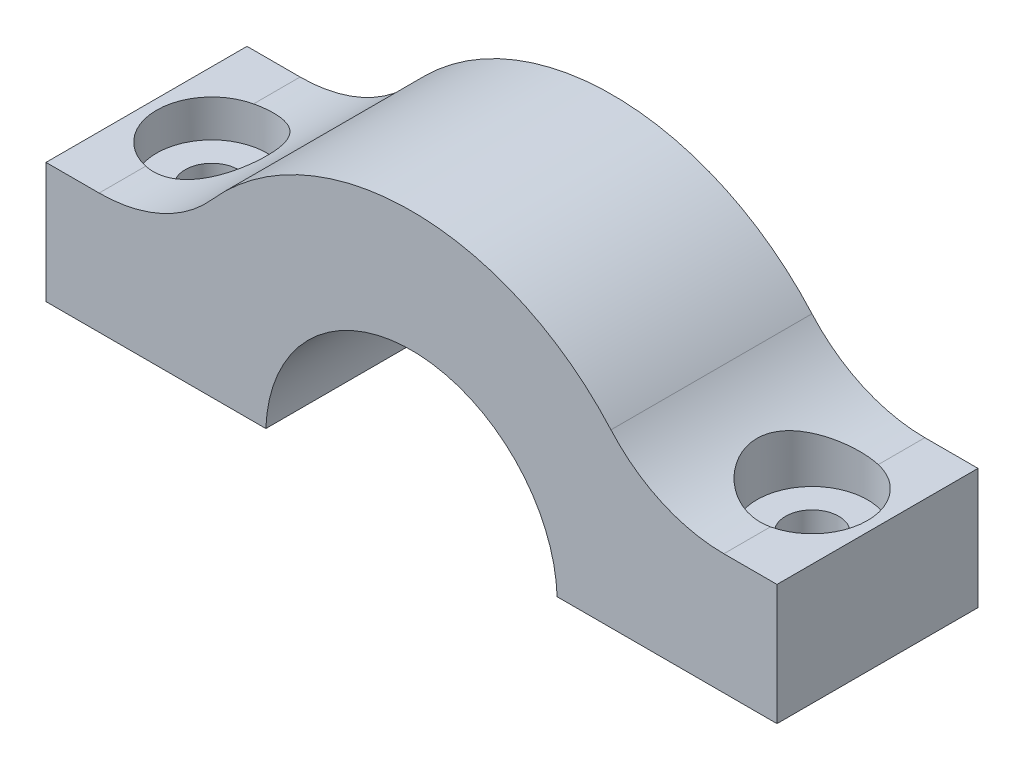
ISO-10303-21;
HEADER;
FILE_DESCRIPTION(('STEP AP214'),'2;1');
FILE_NAME('part.step','',(''),(''),'','','');
FILE_SCHEMA(('AUTOMOTIVE_DESIGN { 1 0 10303 214 1 1 1 1 }'));
ENDSEC;
DATA;
#1=APPLICATION_CONTEXT('core data for automotive mechanical design processes');
#2=APPLICATION_PROTOCOL_DEFINITION('international standard','automotive_design',2000,#1);
#3=PRODUCT_CONTEXT('',#1,'mechanical');
#4=PRODUCT('Part','Part','',(#3));
#5=PRODUCT_RELATED_PRODUCT_CATEGORY('part','',(#4));
#6=PRODUCT_DEFINITION_FORMATION('','',#4);
#7=PRODUCT_DEFINITION_CONTEXT('part definition',#1,'design');
#8=PRODUCT_DEFINITION('design','',#6,#7);
#9=PRODUCT_DEFINITION_SHAPE('','',#8);
#10=(LENGTH_UNIT() NAMED_UNIT(*) SI_UNIT(.MILLI.,.METRE.));
#11=(NAMED_UNIT(*) PLANE_ANGLE_UNIT() SI_UNIT($,.RADIAN.));
#12=(NAMED_UNIT(*) SI_UNIT($,.STERADIAN.) SOLID_ANGLE_UNIT());
#13=UNCERTAINTY_MEASURE_WITH_UNIT(LENGTH_MEASURE(1.E-05),#10,'distance_accuracy_value','');
#14=(GEOMETRIC_REPRESENTATION_CONTEXT(3) GLOBAL_UNCERTAINTY_ASSIGNED_CONTEXT((#13)) GLOBAL_UNIT_ASSIGNED_CONTEXT((#10,
#11,#12)) REPRESENTATION_CONTEXT('',''));
#15=CARTESIAN_POINT('',(0.,0.,0.));
#16=DIRECTION('',(0.,0.,1.));
#17=DIRECTION('',(1.,0.,0.));
#18=AXIS2_PLACEMENT_3D('',#15,#16,#17);
#19=CARTESIAN_POINT('',(0.,23.,10.));
#20=DIRECTION('',(0.,0.,-1.));
#21=DIRECTION('',(-1.,0.,0.));
#22=AXIS2_PLACEMENT_3D('',#19,#20,#21);
#23=CYLINDRICAL_SURFACE('',#22,26.5);
#24=CARTESIAN_POINT('',(0.,23.,-10.));
#25=DIRECTION('',(0.,0.,1.));
#26=DIRECTION('',(1.,0.,0.));
#27=AXIS2_PLACEMENT_3D('',#24,#25,#26);
#28=CIRCLE('',#27,26.5);
#29=CARTESIAN_POINT('',(-19.846610221681,40.5602409638554,-10.));
#30=VERTEX_POINT('',#29);
#31=CARTESIAN_POINT('',(19.846610221681,40.5602409638554,-10.));
#32=VERTEX_POINT('',#31);
#33=EDGE_CURVE('E266',#30,#32,#28,.F.);
#34=ORIENTED_EDGE('',*,*,#33,.F.);
#35=DIRECTION('',(0.,0.,-1.));
#36=VECTOR('',#35,1.);
#37=CARTESIAN_POINT('',(-19.846610221681,40.5602409638554,10.));
#38=LINE('',#37,#36);
#39=CARTESIAN_POINT('',(-19.846610221681,40.5602409638554,10.));
#40=VERTEX_POINT('',#39);
#41=EDGE_CURVE('E286',#30,#40,#38,.F.);
#42=ORIENTED_EDGE('',*,*,#41,.T.);
#43=CARTESIAN_POINT('',(0.,23.,10.));
#44=DIRECTION('',(0.,0.,1.));
#45=DIRECTION('',(1.,0.,0.));
#46=AXIS2_PLACEMENT_3D('',#43,#44,#45);
#47=CIRCLE('',#46,26.5);
#48=CARTESIAN_POINT('',(19.846610221681,40.5602409638554,10.));
#49=VERTEX_POINT('',#48);
#50=EDGE_CURVE('E248',#40,#49,#47,.F.);
#51=ORIENTED_EDGE('',*,*,#50,.T.);
#52=DIRECTION('',(0.,0.,-1.));
#53=VECTOR('',#52,1.);
#54=CARTESIAN_POINT('',(19.846610221681,40.5602409638554,10.));
#55=LINE('',#54,#53);
#56=EDGE_CURVE('E283',#49,#32,#55,.T.);
#57=ORIENTED_EDGE('',*,*,#56,.T.);
#58=EDGE_LOOP('',(#34,#42,#51,#57));
#59=FACE_BOUND('',#58,.T.);
#60=ADVANCED_FACE('F34',(#59),#23,.T.);
#61=CARTESIAN_POINT('',(0.,35.5,10.));
#62=DIRECTION('',(0.,1.,0.));
#63=DIRECTION('',(-1.,0.,0.));
#64=AXIS2_PLACEMENT_3D('',#61,#62,#63);
#65=PLANE('',#64);
#66=DIRECTION('',(1.,0.,0.));
#67=VECTOR('',#66,1.);
#68=CARTESIAN_POINT('',(0.,35.5,10.));
#69=LINE('',#68,#67);
#70=CARTESIAN_POINT('',(-36.3666428910959,35.5,10.));
#71=VERTEX_POINT('',#70);
#72=CARTESIAN_POINT('',(-31.0805405358401,35.5,10.));
#73=VERTEX_POINT('',#72);
#74=EDGE_CURVE('E330',#71,#73,#69,.T.);
#75=ORIENTED_EDGE('',*,*,#74,.T.);
#76=DIRECTION('',(0.,0.,1.));
#77=VECTOR('',#76,1.);
#78=CARTESIAN_POINT('',(-31.0805405358401,35.5,-10.));
#79=LINE('',#78,#77);
#80=CARTESIAN_POINT('',(-31.0805405358401,35.4999999999999,5.36436878934366));
#81=VERTEX_POINT('',#80);
#82=EDGE_CURVE('E280',#73,#81,#79,.F.);
#83=ORIENTED_EDGE('',*,*,#82,.T.);
#84=CARTESIAN_POINT('',(-29.8666428910959,35.4999999999999,0.));
#85=DIRECTION('',(0.,1.,0.));
#86=DIRECTION('',(0.,0.,1.));
#87=AXIS2_PLACEMENT_3D('',#84,#85,#86);
#88=CIRCLE('',#87,5.5);
#89=CARTESIAN_POINT('',(-31.0805405358401,35.4999999999999,-5.36436878934366));
#90=VERTEX_POINT('',#89);
#91=EDGE_CURVE('E271',#90,#81,#88,.T.);
#92=ORIENTED_EDGE('',*,*,#91,.F.);
#93=DIRECTION('',(0.,0.,1.));
#94=VECTOR('',#93,1.);
#95=CARTESIAN_POINT('',(-31.0805405358401,35.5,-10.));
#96=LINE('',#95,#94);
#97=CARTESIAN_POINT('',(-31.0805405358401,35.5,-10.));
#98=VERTEX_POINT('',#97);
#99=EDGE_CURVE('E262',#90,#98,#96,.F.);
#100=ORIENTED_EDGE('',*,*,#99,.T.);
#101=DIRECTION('',(1.,0.,0.));
#102=VECTOR('',#101,1.);
#103=CARTESIAN_POINT('',(0.,35.5,-10.));
#104=LINE('',#103,#102);
#105=CARTESIAN_POINT('',(-36.3666428910959,35.5,-10.));
#106=VERTEX_POINT('',#105);
#107=EDGE_CURVE('E230',#106,#98,#104,.T.);
#108=ORIENTED_EDGE('',*,*,#107,.F.);
#109=DIRECTION('',(0.,0.,-1.));
#110=VECTOR('',#109,1.);
#111=CARTESIAN_POINT('',(-36.3666428910959,35.5,10.));
#112=LINE('',#111,#110);
#113=EDGE_CURVE('E226',#71,#106,#112,.T.);
#114=ORIENTED_EDGE('',*,*,#113,.F.);
#115=EDGE_LOOP('',(#75,#83,#92,#100,#108,#114));
#116=FACE_BOUND('',#115,.T.);
#117=ADVANCED_FACE('F147',(#116),#65,.T.);
#118=CARTESIAN_POINT('',(-36.3666428910958,0.,10.));
#119=DIRECTION('',(-1.,0.,0.));
#120=DIRECTION('',(0.,-1.,0.));
#121=AXIS2_PLACEMENT_3D('',#118,#119,#120);
#122=PLANE('',#121);
#123=DIRECTION('',(0.,1.,0.));
#124=VECTOR('',#123,1.);
#125=CARTESIAN_POINT('',(-36.3666428910958,0.,-10.));
#126=LINE('',#125,#124);
#127=CARTESIAN_POINT('',(-36.3666428910959,23.5,-10.));
#128=VERTEX_POINT('',#127);
#129=EDGE_CURVE('E221',#128,#106,#126,.T.);
#130=ORIENTED_EDGE('',*,*,#129,.F.);
#131=DIRECTION('',(0.,0.,-1.));
#132=VECTOR('',#131,1.);
#133=CARTESIAN_POINT('',(-36.3666428910959,23.5,10.));
#134=LINE('',#133,#132);
#135=CARTESIAN_POINT('',(-36.3666428910959,23.5,10.));
#136=VERTEX_POINT('',#135);
#137=EDGE_CURVE('E224',#136,#128,#134,.T.);
#138=ORIENTED_EDGE('',*,*,#137,.F.);
#139=DIRECTION('',(0.,1.,0.));
#140=VECTOR('',#139,1.);
#141=CARTESIAN_POINT('',(-36.3666428910958,0.,10.));
#142=LINE('',#141,#140);
#143=EDGE_CURVE('E333',#136,#71,#142,.T.);
#144=ORIENTED_EDGE('',*,*,#143,.T.);
#145=ORIENTED_EDGE('',*,*,#113,.T.);
#146=EDGE_LOOP('',(#130,#138,#144,#145));
#147=FACE_BOUND('',#146,.T.);
#148=ADVANCED_FACE('F154',(#147),#122,.T.);
#149=CARTESIAN_POINT('',(0.,23.5,10.));
#150=DIRECTION('',(0.,-1.,0.));
#151=DIRECTION('',(1.,0.,0.));
#152=AXIS2_PLACEMENT_3D('',#149,#150,#151);
#153=PLANE('',#152);
#154=CARTESIAN_POINT('',(-19.,23.5,0.));
#155=DIRECTION('',(0.,-1.,0.));
#156=DIRECTION('',(1.,0.,0.));
#157=AXIS2_PLACEMENT_3D('',#154,#155,#156);
#158=CIRCLE('',#157,0.985720517649482);
#159=CARTESIAN_POINT('',(-18.0142794823505,23.5,0.));
#160=VERTEX_POINT('',#159);
#161=EDGE_CURVE('E277',#160,#160,#158,.T.);
#162=ORIENTED_EDGE('',*,*,#161,.F.);
#163=EDGE_LOOP('',(#162));
#164=FACE_BOUND('',#163,.T.);
#165=CARTESIAN_POINT('',(-29.8666428910959,23.5,0.));
#166=DIRECTION('',(0.,-1.,0.));
#167=DIRECTION('',(1.,0.,0.));
#168=AXIS2_PLACEMENT_3D('',#165,#166,#167);
#169=CIRCLE('',#168,2.65);
#170=CARTESIAN_POINT('',(-27.2166428910959,23.5,0.));
#171=VERTEX_POINT('',#170);
#172=EDGE_CURVE('E263',#171,#171,#169,.T.);
#173=ORIENTED_EDGE('',*,*,#172,.F.);
#174=EDGE_LOOP('',(#173));
#175=FACE_BOUND('',#174,.T.);
#176=DIRECTION('',(-1.,0.,0.));
#177=VECTOR('',#176,1.);
#178=CARTESIAN_POINT('',(0.,23.5,-10.));
#179=LINE('',#178,#177);
#180=CARTESIAN_POINT('',(-14.4913767461894,23.5,-10.));
#181=VERTEX_POINT('',#180);
#182=EDGE_CURVE('E229',#181,#128,#179,.T.);
#183=ORIENTED_EDGE('',*,*,#182,.F.);
#184=DIRECTION('',(0.,0.,-1.));
#185=VECTOR('',#184,1.);
#186=CARTESIAN_POINT('',(-14.4913767461894,23.5,10.));
#187=LINE('',#186,#185);
#188=CARTESIAN_POINT('',(-14.4913767461894,23.5,10.));
#189=VERTEX_POINT('',#188);
#190=EDGE_CURVE('E258',#189,#181,#187,.T.);
#191=ORIENTED_EDGE('',*,*,#190,.F.);
#192=DIRECTION('',(-1.,0.,0.));
#193=VECTOR('',#192,1.);
#194=CARTESIAN_POINT('',(0.,23.5,10.));
#195=LINE('',#194,#193);
#196=EDGE_CURVE('E335',#189,#136,#195,.T.);
#197=ORIENTED_EDGE('',*,*,#196,.T.);
#198=ORIENTED_EDGE('',*,*,#137,.T.);
#199=EDGE_LOOP('',(#183,#191,#197,#198));
#200=FACE_BOUND('',#199,.T.);
#201=ADVANCED_FACE('F210',(#164,#175,#200),#153,.T.);
#202=CARTESIAN_POINT('',(0.,23.,10.));
#203=DIRECTION('',(0.,0.,-1.));
#204=DIRECTION('',(-1.,0.,0.));
#205=AXIS2_PLACEMENT_3D('',#202,#203,#204);
#206=CYLINDRICAL_SURFACE('',#205,14.5);
#207=CARTESIAN_POINT('',(0.,23.,-10.));
#208=DIRECTION('',(0.,0.,1.));
#209=DIRECTION('',(1.,0.,0.));
#210=AXIS2_PLACEMENT_3D('',#207,#208,#209);
#211=CIRCLE('',#210,14.5);
#212=CARTESIAN_POINT('',(14.4913767461894,23.5,-10.));
#213=VERTEX_POINT('',#212);
#214=EDGE_CURVE('E236',#213,#181,#211,.T.);
#215=ORIENTED_EDGE('',*,*,#214,.F.);
#216=DIRECTION('',(0.,0.,-1.));
#217=VECTOR('',#216,1.);
#218=CARTESIAN_POINT('',(14.4913767461894,23.5,10.));
#219=LINE('',#218,#217);
#220=CARTESIAN_POINT('',(14.4913767461894,23.5,10.));
#221=VERTEX_POINT('',#220);
#222=EDGE_CURVE('E256',#221,#213,#219,.T.);
#223=ORIENTED_EDGE('',*,*,#222,.F.);
#224=CARTESIAN_POINT('',(0.,23.,10.));
#225=DIRECTION('',(0.,0.,1.));
#226=DIRECTION('',(1.,0.,0.));
#227=AXIS2_PLACEMENT_3D('',#224,#225,#226);
#228=CIRCLE('',#227,14.5);
#229=EDGE_CURVE('E338',#221,#189,#228,.T.);
#230=ORIENTED_EDGE('',*,*,#229,.T.);
#231=ORIENTED_EDGE('',*,*,#190,.T.);
#232=EDGE_LOOP('',(#215,#223,#230,#231));
#233=FACE_BOUND('',#232,.T.);
#234=ADVANCED_FACE('F206',(#233),#206,.F.);
#235=CARTESIAN_POINT('',(0.,23.5,10.));
#236=DIRECTION('',(0.,1.,0.));
#237=DIRECTION('',(-1.,0.,0.));
#238=AXIS2_PLACEMENT_3D('',#235,#236,#237);
#239=PLANE('',#238);
#240=CARTESIAN_POINT('',(19.,23.5,0.));
#241=DIRECTION('',(0.,1.,0.));
#242=DIRECTION('',(-1.,0.,0.));
#243=AXIS2_PLACEMENT_3D('',#240,#241,#242);
#244=CIRCLE('',#243,0.985720517649486);
#245=CARTESIAN_POINT('',(18.0142794823505,23.5,0.));
#246=VERTEX_POINT('',#245);
#247=EDGE_CURVE('E273',#246,#246,#244,.T.);
#248=ORIENTED_EDGE('',*,*,#247,.T.);
#249=EDGE_LOOP('',(#248));
#250=FACE_BOUND('',#249,.T.);
#251=CARTESIAN_POINT('',(29.8666428910958,23.5,0.));
#252=DIRECTION('',(0.,1.,0.));
#253=DIRECTION('',(-1.,0.,0.));
#254=AXIS2_PLACEMENT_3D('',#251,#252,#253);
#255=CIRCLE('',#254,2.65);
#256=CARTESIAN_POINT('',(27.2166428910958,23.5,0.));
#257=VERTEX_POINT('',#256);
#258=EDGE_CURVE('E268',#257,#257,#255,.T.);
#259=ORIENTED_EDGE('',*,*,#258,.T.);
#260=EDGE_LOOP('',(#259));
#261=FACE_BOUND('',#260,.T.);
#262=DIRECTION('',(1.,0.,0.));
#263=VECTOR('',#262,1.);
#264=CARTESIAN_POINT('',(0.,23.5,-10.));
#265=LINE('',#264,#263);
#266=CARTESIAN_POINT('',(36.3666428910958,23.5,-10.));
#267=VERTEX_POINT('',#266);
#268=EDGE_CURVE('E239',#213,#267,#265,.T.);
#269=ORIENTED_EDGE('',*,*,#268,.T.);
#270=DIRECTION('',(0.,0.,-1.));
#271=VECTOR('',#270,1.);
#272=CARTESIAN_POINT('',(36.3666428910958,23.5,10.));
#273=LINE('',#272,#271);
#274=CARTESIAN_POINT('',(36.3666428910958,23.5,10.));
#275=VERTEX_POINT('',#274);
#276=EDGE_CURVE('E252',#275,#267,#273,.T.);
#277=ORIENTED_EDGE('',*,*,#276,.F.);
#278=DIRECTION('',(1.,0.,0.));
#279=VECTOR('',#278,1.);
#280=CARTESIAN_POINT('',(0.,23.5,10.));
#281=LINE('',#280,#279);
#282=EDGE_CURVE('E341',#221,#275,#281,.T.);
#283=ORIENTED_EDGE('',*,*,#282,.F.);
#284=ORIENTED_EDGE('',*,*,#222,.T.);
#285=EDGE_LOOP('',(#269,#277,#283,#284));
#286=FACE_BOUND('',#285,.T.);
#287=ADVANCED_FACE('F202',(#250,#261,#286),#239,.F.);
#288=CARTESIAN_POINT('',(36.3666428910958,0.,10.));
#289=DIRECTION('',(-1.,0.,0.));
#290=DIRECTION('',(0.,-1.,0.));
#291=AXIS2_PLACEMENT_3D('',#288,#289,#290);
#292=PLANE('',#291);
#293=DIRECTION('',(0.,1.,0.));
#294=VECTOR('',#293,1.);
#295=CARTESIAN_POINT('',(36.3666428910958,0.,-10.));
#296=LINE('',#295,#294);
#297=CARTESIAN_POINT('',(36.3666428910959,35.5,-10.));
#298=VERTEX_POINT('',#297);
#299=EDGE_CURVE('E244',#267,#298,#296,.T.);
#300=ORIENTED_EDGE('',*,*,#299,.T.);
#301=DIRECTION('',(0.,0.,-1.));
#302=VECTOR('',#301,1.);
#303=CARTESIAN_POINT('',(36.3666428910959,35.5,10.));
#304=LINE('',#303,#302);
#305=CARTESIAN_POINT('',(36.3666428910959,35.5,10.));
#306=VERTEX_POINT('',#305);
#307=EDGE_CURVE('E249',#306,#298,#304,.T.);
#308=ORIENTED_EDGE('',*,*,#307,.F.);
#309=DIRECTION('',(0.,1.,0.));
#310=VECTOR('',#309,1.);
#311=CARTESIAN_POINT('',(36.3666428910958,0.,10.));
#312=LINE('',#311,#310);
#313=EDGE_CURVE('E343',#275,#306,#312,.T.);
#314=ORIENTED_EDGE('',*,*,#313,.F.);
#315=ORIENTED_EDGE('',*,*,#276,.T.);
#316=EDGE_LOOP('',(#300,#308,#314,#315));
#317=FACE_BOUND('',#316,.T.);
#318=ADVANCED_FACE('F199',(#317),#292,.F.);
#319=CARTESIAN_POINT('',(0.,35.5,10.));
#320=DIRECTION('',(0.,-1.,0.));
#321=DIRECTION('',(1.,0.,0.));
#322=AXIS2_PLACEMENT_3D('',#319,#320,#321);
#323=PLANE('',#322);
#324=DIRECTION('',(-1.,0.,0.));
#325=VECTOR('',#324,1.);
#326=CARTESIAN_POINT('',(0.,35.5,-10.));
#327=LINE('',#326,#325);
#328=CARTESIAN_POINT('',(31.0805405358401,35.5,-10.));
#329=VERTEX_POINT('',#328);
#330=EDGE_CURVE('E246',#298,#329,#327,.T.);
#331=ORIENTED_EDGE('',*,*,#330,.T.);
#332=DIRECTION('',(0.,0.,-1.));
#333=VECTOR('',#332,1.);
#334=CARTESIAN_POINT('',(31.0805405358401,35.5,10.));
#335=LINE('',#334,#333);
#336=CARTESIAN_POINT('',(31.0805405358401,35.5,-5.36436878934365));
#337=VERTEX_POINT('',#336);
#338=EDGE_CURVE('E170',#329,#337,#335,.F.);
#339=ORIENTED_EDGE('',*,*,#338,.T.);
#340=CARTESIAN_POINT('',(29.8666428910958,35.5,0.));
#341=DIRECTION('',(0.,1.,0.));
#342=DIRECTION('',(0.,0.,1.));
#343=AXIS2_PLACEMENT_3D('',#340,#341,#342);
#344=CIRCLE('',#343,5.5);
#345=CARTESIAN_POINT('',(31.0805405358401,35.5,5.36436878934365));
#346=VERTEX_POINT('',#345);
#347=EDGE_CURVE('E276',#346,#337,#344,.T.);
#348=ORIENTED_EDGE('',*,*,#347,.F.);
#349=DIRECTION('',(0.,0.,-1.));
#350=VECTOR('',#349,1.);
#351=CARTESIAN_POINT('',(31.0805405358401,35.5,10.));
#352=LINE('',#351,#350);
#353=CARTESIAN_POINT('',(31.0805405358401,35.5,10.));
#354=VERTEX_POINT('',#353);
#355=EDGE_CURVE('E50',#346,#354,#352,.F.);
#356=ORIENTED_EDGE('',*,*,#355,.T.);
#357=DIRECTION('',(-1.,0.,0.));
#358=VECTOR('',#357,1.);
#359=CARTESIAN_POINT('',(0.,35.5,10.));
#360=LINE('',#359,#358);
#361=EDGE_CURVE('E253',#306,#354,#360,.T.);
#362=ORIENTED_EDGE('',*,*,#361,.F.);
#363=ORIENTED_EDGE('',*,*,#307,.T.);
#364=EDGE_LOOP('',(#331,#339,#348,#356,#362,#363));
#365=FACE_BOUND('',#364,.T.);
#366=ADVANCED_FACE('F193',(#365),#323,.F.);
#367=CARTESIAN_POINT('',(0.,0.,10.));
#368=DIRECTION('',(0.,0.,1.));
#369=DIRECTION('',(1.,0.,0.));
#370=AXIS2_PLACEMENT_3D('',#367,#368,#369);
#371=PLANE('',#370);
#372=ORIENTED_EDGE('',*,*,#50,.F.);
#373=CARTESIAN_POINT('',(-31.0805405358401,50.5,10.));
#374=DIRECTION('',(0.,0.,1.));
#375=DIRECTION('',(1.,0.,0.));
#376=AXIS2_PLACEMENT_3D('',#373,#374,#375);
#377=CIRCLE('',#376,15.);
#378=EDGE_CURVE('E295',#40,#73,#377,.F.);
#379=ORIENTED_EDGE('',*,*,#378,.T.);
#380=ORIENTED_EDGE('',*,*,#74,.F.);
#381=ORIENTED_EDGE('',*,*,#143,.F.);
#382=ORIENTED_EDGE('',*,*,#196,.F.);
#383=ORIENTED_EDGE('',*,*,#229,.F.);
#384=ORIENTED_EDGE('',*,*,#282,.T.);
#385=ORIENTED_EDGE('',*,*,#313,.T.);
#386=ORIENTED_EDGE('',*,*,#361,.T.);
#387=CARTESIAN_POINT('',(31.0805405358401,50.5,10.));
#388=DIRECTION('',(0.,0.,1.));
#389=DIRECTION('',(1.,0.,0.));
#390=AXIS2_PLACEMENT_3D('',#387,#388,#389);
#391=CIRCLE('',#390,15.);
#392=EDGE_CURVE('E11',#354,#49,#391,.F.);
#393=ORIENTED_EDGE('',*,*,#392,.T.);
#394=EDGE_LOOP('',(#372,#379,#380,#381,#382,#383,#384,#385,#386,#393));
#395=FACE_BOUND('',#394,.T.);
#396=ADVANCED_FACE('F190',(#395),#371,.T.);
#397=CARTESIAN_POINT('',(0.,0.,-10.));
#398=DIRECTION('',(0.,0.,1.));
#399=DIRECTION('',(1.,0.,0.));
#400=AXIS2_PLACEMENT_3D('',#397,#398,#399);
#401=PLANE('',#400);
#402=ORIENTED_EDGE('',*,*,#107,.T.);
#403=CARTESIAN_POINT('',(-31.0805405358401,50.5,-10.));
#404=DIRECTION('',(0.,0.,1.));
#405=DIRECTION('',(1.,0.,0.));
#406=AXIS2_PLACEMENT_3D('',#403,#404,#405);
#407=CIRCLE('',#406,15.);
#408=EDGE_CURVE('E169',#98,#30,#407,.T.);
#409=ORIENTED_EDGE('',*,*,#408,.T.);
#410=ORIENTED_EDGE('',*,*,#33,.T.);
#411=CARTESIAN_POINT('',(31.0805405358401,50.5,-10.));
#412=DIRECTION('',(0.,0.,1.));
#413=DIRECTION('',(1.,0.,0.));
#414=AXIS2_PLACEMENT_3D('',#411,#412,#413);
#415=CIRCLE('',#414,15.);
#416=EDGE_CURVE('E58',#32,#329,#415,.T.);
#417=ORIENTED_EDGE('',*,*,#416,.T.);
#418=ORIENTED_EDGE('',*,*,#330,.F.);
#419=ORIENTED_EDGE('',*,*,#299,.F.);
#420=ORIENTED_EDGE('',*,*,#268,.F.);
#421=ORIENTED_EDGE('',*,*,#214,.T.);
#422=ORIENTED_EDGE('',*,*,#182,.T.);
#423=ORIENTED_EDGE('',*,*,#129,.T.);
#424=EDGE_LOOP('',(#402,#409,#410,#417,#418,#419,#420,#421,#422,#423));
#425=FACE_BOUND('',#424,.T.);
#426=ADVANCED_FACE('F188',(#425),#401,.F.);
#427=CARTESIAN_POINT('',(-29.8666428910959,35.4999999999999,0.));
#428=DIRECTION('',(0.,1.,0.));
#429=DIRECTION('',(0.,0.,1.));
#430=AXIS2_PLACEMENT_3D('',#427,#428,#429);
#431=CYLINDRICAL_SURFACE('',#430,2.65);
#432=ORIENTED_EDGE('',*,*,#172,.T.);
#433=EDGE_LOOP('',(#432));
#434=FACE_BOUND('',#433,.T.);
#435=CARTESIAN_POINT('',(-29.8666428910959,31.7999999999999,0.));
#436=DIRECTION('',(0.,1.,0.));
#437=DIRECTION('',(0.,0.,1.));
#438=AXIS2_PLACEMENT_3D('',#435,#436,#437);
#439=CIRCLE('',#438,2.65);
#440=CARTESIAN_POINT('',(-29.8666428910959,31.7999999999999,2.65));
#441=VERTEX_POINT('',#440);
#442=EDGE_CURVE('E267',#441,#441,#439,.T.);
#443=ORIENTED_EDGE('',*,*,#442,.T.);
#444=EDGE_LOOP('',(#443));
#445=FACE_BOUND('',#444,.T.);
#446=ADVANCED_FACE('F184',(#434,#445),#431,.F.);
#447=CARTESIAN_POINT('',(-27.2166428910959,31.7999999999999,0.));
#448=DIRECTION('',(0.,-1.,0.));
#449=DIRECTION('',(0.,0.,-1.));
#450=AXIS2_PLACEMENT_3D('',#447,#448,#449);
#451=PLANE('',#450);
#452=ORIENTED_EDGE('',*,*,#442,.F.);
#453=EDGE_LOOP('',(#452));
#454=FACE_BOUND('',#453,.T.);
#455=CARTESIAN_POINT('',(-29.8666428910959,31.7999999999999,0.));
#456=DIRECTION('',(0.,1.,0.));
#457=DIRECTION('',(0.,0.,1.));
#458=AXIS2_PLACEMENT_3D('',#455,#456,#457);
#459=CIRCLE('',#458,5.5);
#460=CARTESIAN_POINT('',(-29.8666428910959,31.7999999999999,5.5));
#461=VERTEX_POINT('',#460);
#462=EDGE_CURVE('E323',#461,#461,#459,.T.);
#463=ORIENTED_EDGE('',*,*,#462,.T.);
#464=EDGE_LOOP('',(#463));
#465=FACE_BOUND('',#464,.T.);
#466=ADVANCED_FACE('F179',(#454,#465),#451,.F.);
#467=CARTESIAN_POINT('',(-29.8666428910959,35.4999999999999,0.));
#468=DIRECTION('',(0.,1.,0.));
#469=DIRECTION('',(0.,0.,1.));
#470=AXIS2_PLACEMENT_3D('',#467,#468,#469);
#471=CYLINDRICAL_SURFACE('',#470,5.5);
#472=ORIENTED_EDGE('',*,*,#462,.F.);
#473=EDGE_LOOP('',(#472));
#474=FACE_BOUND('',#473,.T.);
#475=ORIENTED_EDGE('',*,*,#91,.T.);
#476=CARTESIAN_POINT('',(-31.0805405358401,35.4999999999999,5.36436878934366));
#477=CARTESIAN_POINT('',(-30.9363707159337,35.499979514955,5.39701477946052));
#478=CARTESIAN_POINT('',(-30.7908773252318,35.502077662303,5.42380739060261));
#479=CARTESIAN_POINT('',(-30.4983521467943,35.5105937664784,5.465592925898));
#480=CARTESIAN_POINT('',(-30.3513205852005,35.5170110968474,5.48058756055654));
#481=CARTESIAN_POINT('',(-30.0572084784222,35.5342232960878,5.49866772345842));
#482=CARTESIAN_POINT('',(-29.9101292876569,35.5450055349663,5.50178734374847));
#483=CARTESIAN_POINT('',(-29.6165754181298,35.5708839518712,5.49627267877371));
#484=CARTESIAN_POINT('',(-29.4701007371773,35.5859801142515,5.48763843613886));
#485=CARTESIAN_POINT('',(-29.1788273009378,35.6203161705687,5.45878418876977));
#486=CARTESIAN_POINT('',(-29.034028152259,35.6395550701578,5.43856696227562));
#487=CARTESIAN_POINT('',(-28.746994564368,35.6819158421265,5.38680457530349));
#488=CARTESIAN_POINT('',(-28.6047611044134,35.7050391637608,5.35525518184309));
#489=CARTESIAN_POINT('',(-28.3238229651016,35.7548021514545,5.28117506062534));
#490=CARTESIAN_POINT('',(-28.1851181699719,35.7814417019715,5.23864469365636));
#491=CARTESIAN_POINT('',(-27.9120050576055,35.8378092389557,5.14298917978847));
#492=CARTESIAN_POINT('',(-27.777598408203,35.8675384057356,5.0898599766817));
#493=CARTESIAN_POINT('',(-27.5099945662206,35.9304894567364,4.97174193731086));
#494=CARTESIAN_POINT('',(-27.3769487744585,35.9637882663297,4.90645067000541));
#495=CARTESIAN_POINT('',(-27.1169543253632,36.0325157283142,4.76561576487944));
#496=CARTESIAN_POINT('',(-26.9900077655327,36.0679451041005,4.69006863379352));
#497=CARTESIAN_POINT('',(-26.6193256959879,36.1764640225957,4.44879709901827));
#498=CARTESIAN_POINT('',(-26.3856187587259,36.2518155975881,4.26838523792679));
#499=CARTESIAN_POINT('',(-25.9353126613132,36.407900197727,3.85918470730384));
#500=CARTESIAN_POINT('',(-25.7209302285213,36.4886534330257,3.62795402500115));
#501=CARTESIAN_POINT('',(-25.4306763814805,36.604319036618,3.25531537963241));
#502=CARTESIAN_POINT('',(-25.3390967033191,36.6419857911347,3.12671352097175));
#503=CARTESIAN_POINT('',(-25.1670334141613,36.7145318256547,2.86157491281815));
#504=CARTESIAN_POINT('',(-25.0865448625468,36.7494123438766,2.72504173516773));
#505=CARTESIAN_POINT('',(-24.9371858597011,36.8154873908931,2.44453664902836));
#506=CARTESIAN_POINT('',(-24.8683394494215,36.8466742534872,2.30055013080694));
#507=CARTESIAN_POINT('',(-24.743172694198,36.9043198981694,2.00638595197058));
#508=CARTESIAN_POINT('',(-24.6868465557118,36.930780865966,1.85621119315261));
#509=CARTESIAN_POINT('',(-24.5873599115019,36.97810503875,1.55079040531162));
#510=CARTESIAN_POINT('',(-24.5441920563585,36.9989713677763,1.39554726102707));
#511=CARTESIAN_POINT('',(-24.471547708831,37.0343825311416,1.08118594532215));
#512=CARTESIAN_POINT('',(-24.44206965512,37.0489280863549,0.92206821797889));
#513=CARTESIAN_POINT('',(-24.3992756108851,37.0701373275722,0.616063789648366));
#514=CARTESIAN_POINT('',(-24.3847278184887,37.0774003144339,0.469389763649498));
#515=CARTESIAN_POINT('',(-24.3674590606374,37.0860284338221,0.175177441257786));
#516=CARTESIAN_POINT('',(-24.3647373156349,37.0873939550969,0.0276392024739952));
#517=CARTESIAN_POINT('',(-24.3711548168599,37.0841826482972,-0.267082126990716));
#518=CARTESIAN_POINT('',(-24.3802916572729,37.0796070255343,-0.414265283640623));
#519=CARTESIAN_POINT('',(-24.4103034892686,37.0646653520293,-0.707127445249886));
#520=CARTESIAN_POINT('',(-24.4311783120391,37.0542993845623,-0.852806471810506));
#521=CARTESIAN_POINT('',(-24.482865196499,37.0288657509159,-1.13316172006793));
#522=CARTESIAN_POINT('',(-24.5130299453379,37.0141060031647,-1.26798569142488));
#523=CARTESIAN_POINT('',(-24.5832357768891,36.9801427597271,-1.53447827080736));
#524=CARTESIAN_POINT('',(-24.6232800206356,36.9609378418901,-1.6661458540951));
#525=CARTESIAN_POINT('',(-24.757689465478,36.8973731608902,-2.05517445192991));
#526=CARTESIAN_POINT('',(-24.8663705633288,36.8470433109231,-2.30677080911874));
#527=CARTESIAN_POINT('',(-25.1259539930103,36.7317711127171,-2.80341032086884));
#528=CARTESIAN_POINT('',(-25.2789898147377,36.6661357103627,-3.0471652475457));
#529=CARTESIAN_POINT('',(-25.6199520272634,36.5280336060307,-3.50679288727502));
#530=CARTESIAN_POINT('',(-25.8078972557137,36.4555632262367,-3.72265043932164));
#531=CARTESIAN_POINT('',(-26.2338769085135,36.3026239224307,-4.14127554359751));
#532=CARTESIAN_POINT('',(-26.474948368955,36.2220394914526,-4.34094364710044));
#533=CARTESIAN_POINT('',(-26.859935881112,36.1053961802135,-4.60805924660717));
#534=CARTESIAN_POINT('',(-26.9922432127449,36.0672002334516,-4.69173816054018));
#535=CARTESIAN_POINT('',(-27.2639550366146,35.9929858831787,-4.84773311342266));
#536=CARTESIAN_POINT('',(-27.4033565596037,35.9569665822263,-4.92005385533899));
#537=CARTESIAN_POINT('',(-27.6904939759101,35.8873434534311,-5.05369398645095));
#538=CARTESIAN_POINT('',(-27.8383212644622,35.8537821071073,-5.11483908942798));
#539=CARTESIAN_POINT('',(-28.1393893623712,35.7903678804339,-5.22419641988205));
#540=CARTESIAN_POINT('',(-28.2926277673077,35.7605133789371,-5.27241431170254));
#541=CARTESIAN_POINT('',(-28.6034362400827,35.7051067339897,-5.3553875589298));
#542=CARTESIAN_POINT('',(-28.7610054029323,35.679553699504,-5.39014570442461));
#543=CARTESIAN_POINT('',(-29.0792020221886,35.6332428123239,-5.44573240250245));
#544=CARTESIAN_POINT('',(-29.2398278155221,35.6124824284412,-5.46656831903129));
#545=CARTESIAN_POINT('',(-29.5409340841665,35.5785604468861,-5.49213506996375));
#546=CARTESIAN_POINT('',(-29.6811914330678,35.5647500693088,-5.49866723718489));
#547=CARTESIAN_POINT('',(-29.9621188680844,35.5410894583441,-5.50096477543816));
#548=CARTESIAN_POINT('',(-30.1027889044261,35.5312387656872,-5.49673139554447));
#549=CARTESIAN_POINT('',(-30.3838928030608,35.5155245692901,-5.47743803124285));
#550=CARTESIAN_POINT('',(-30.5243256196842,35.5096691328452,-5.46235626690063));
#551=CARTESIAN_POINT('',(-30.8037553353892,35.5018979159334,-5.42142195490012));
#552=CARTESIAN_POINT('',(-30.9427519000164,35.4999830333948,-5.39556695397349));
#553=CARTESIAN_POINT('',(-31.0805405358401,35.5,-5.36436878934366));
#554=B_SPLINE_CURVE_WITH_KNOTS('',3,(#476,#477,#478,#479,#480,#481,#482,#483,#484,#485,#486,
#487,#488,#489,#490,#491,#492,#493,#494,#495,#496,#497,#498,#499,#500,#501,#502,#503,#504,#505,
#506,#507,#508,#509,#510,#511,#512,#513,#514,#515,#516,#517,#518,#519,#520,#521,#522,#523,#524,
#525,#526,#527,#528,#529,#530,#531,#532,#533,#534,#535,#536,#537,#538,#539,#540,#541,#542,#543,
#544,#545,#546,#547,#548,#549,#550,#551,#552,#553),.UNSPECIFIED.,.F.,.F.,(4,2,2,2,2,2,2,2,2,2,2,
2,2,2,2,2,2,2,2,2,2,2,2,2,2,2,2,2,2,2,2,2,2,2,2,2,2,2,4),(0.,0.443321629200326,
0.886578972481407,1.32856280173761,1.77054502797185,2.21242128678077,2.65446277461791,
3.09648974068776,3.53868619751585,3.99386706501139,4.44920336318507,5.35944703934553,
6.33107836927198,6.81751450233749,7.30373324374218,7.79094407755299,8.27792899134672,
8.76464140435948,9.25129829401016,9.69343644003771,10.1355454408267,10.5775647626273,
11.0195777276017,11.4359278313652,11.852411323282,12.6847434816572,13.566772457139,
14.4492787790756,15.4141086445534,15.8970700834662,16.3798310170323,16.8695758076589,
17.3591056537475,17.8485339701778,18.3377032057761,18.7605129601132,19.1832736601252,
19.6068854999878,20.0305938569876),.UNSPECIFIED.);
#555=EDGE_CURVE('E161',#81,#90,#554,.T.);
#556=ORIENTED_EDGE('',*,*,#555,.T.);
#557=EDGE_LOOP('',(#475,#556));
#558=FACE_BOUND('',#557,.T.);
#559=ADVANCED_FACE('F173',(#474,#558),#471,.F.);
#560=CARTESIAN_POINT('',(29.8666428910958,35.5,0.));
#561=DIRECTION('',(0.,1.,0.));
#562=DIRECTION('',(0.,0.,1.));
#563=AXIS2_PLACEMENT_3D('',#560,#561,#562);
#564=CYLINDRICAL_SURFACE('',#563,2.65);
#565=CARTESIAN_POINT('',(29.8666428910958,31.8,0.));
#566=DIRECTION('',(0.,1.,0.));
#567=DIRECTION('',(0.,0.,1.));
#568=AXIS2_PLACEMENT_3D('',#565,#566,#567);
#569=CIRCLE('',#568,2.65000000000001);
#570=CARTESIAN_POINT('',(29.8666428910958,31.8,2.65000000000001));
#571=VERTEX_POINT('',#570);
#572=EDGE_CURVE('E272',#571,#571,#569,.T.);
#573=ORIENTED_EDGE('',*,*,#572,.T.);
#574=EDGE_LOOP('',(#573));
#575=FACE_BOUND('',#574,.T.);
#576=ORIENTED_EDGE('',*,*,#258,.F.);
#577=EDGE_LOOP('',(#576));
#578=FACE_BOUND('',#577,.T.);
#579=ADVANCED_FACE('F178',(#575,#578),#564,.F.);
#580=CARTESIAN_POINT('',(32.5166428910958,31.8,0.));
#581=DIRECTION('',(0.,-1.,0.));
#582=DIRECTION('',(0.,0.,-1.));
#583=AXIS2_PLACEMENT_3D('',#580,#581,#582);
#584=PLANE('',#583);
#585=ORIENTED_EDGE('',*,*,#572,.F.);
#586=EDGE_LOOP('',(#585));
#587=FACE_BOUND('',#586,.T.);
#588=CARTESIAN_POINT('',(29.8666428910958,31.8,0.));
#589=DIRECTION('',(0.,1.,0.));
#590=DIRECTION('',(0.,0.,1.));
#591=AXIS2_PLACEMENT_3D('',#588,#589,#590);
#592=CIRCLE('',#591,5.5);
#593=CARTESIAN_POINT('',(29.8666428910958,31.8,5.5));
#594=VERTEX_POINT('',#593);
#595=EDGE_CURVE('E292',#594,#594,#592,.T.);
#596=ORIENTED_EDGE('',*,*,#595,.T.);
#597=EDGE_LOOP('',(#596));
#598=FACE_BOUND('',#597,.T.);
#599=ADVANCED_FACE('F304',(#587,#598),#584,.F.);
#600=CARTESIAN_POINT('',(29.8666428910958,35.5,0.));
#601=DIRECTION('',(0.,1.,0.));
#602=DIRECTION('',(0.,0.,1.));
#603=AXIS2_PLACEMENT_3D('',#600,#601,#602);
#604=CYLINDRICAL_SURFACE('',#603,5.5);
#605=ORIENTED_EDGE('',*,*,#595,.F.);
#606=EDGE_LOOP('',(#605));
#607=FACE_BOUND('',#606,.T.);
#608=ORIENTED_EDGE('',*,*,#347,.T.);
#609=CARTESIAN_POINT('',(31.0805405358401,35.5,-5.36436878934365));
#610=CARTESIAN_POINT('',(30.9363707159337,35.499979514955,-5.39701477946051));
#611=CARTESIAN_POINT('',(30.7908773252318,35.502077662303,-5.4238073906026));
#612=CARTESIAN_POINT('',(30.4983521467943,35.5105937664784,-5.46559292589799));
#613=CARTESIAN_POINT('',(30.3513205852005,35.5170110968474,-5.48058756055653));
#614=CARTESIAN_POINT('',(30.0572084784222,35.5342232960879,-5.49866772345841));
#615=CARTESIAN_POINT('',(29.9101292876569,35.5450055349663,-5.50178734374846));
#616=CARTESIAN_POINT('',(29.6165754181298,35.5708839518713,-5.49627267877371));
#617=CARTESIAN_POINT('',(29.4701007371773,35.5859801142515,-5.48763843613886));
#618=CARTESIAN_POINT('',(29.1788273009378,35.6203161705687,-5.45878418876977));
#619=CARTESIAN_POINT('',(29.034028152259,35.6395550701578,-5.43856696227562));
#620=CARTESIAN_POINT('',(28.746994564368,35.6819158421266,-5.3868045753035));
#621=CARTESIAN_POINT('',(28.6047611044134,35.7050391637608,-5.3552551818431));
#622=CARTESIAN_POINT('',(28.3238229651016,35.7548021514545,-5.28117506062535));
#623=CARTESIAN_POINT('',(28.1851181699719,35.7814417019715,-5.23864469365637));
#624=CARTESIAN_POINT('',(27.9120050576055,35.8378092389557,-5.14298917978848));
#625=CARTESIAN_POINT('',(27.777598408203,35.8675384057356,-5.08985997668171));
#626=CARTESIAN_POINT('',(27.5099945662206,35.9304894567364,-4.97174193731087));
#627=CARTESIAN_POINT('',(27.3769487744585,35.9637882663297,-4.90645067000542));
#628=CARTESIAN_POINT('',(27.1169543253632,36.0325157283142,-4.76561576487945));
#629=CARTESIAN_POINT('',(26.9900077655327,36.0679451041005,-4.69006863379353));
#630=CARTESIAN_POINT('',(26.6193256959879,36.1764640225957,-4.44879709901829));
#631=CARTESIAN_POINT('',(26.3856187587259,36.2518155975881,-4.26838523792681));
#632=CARTESIAN_POINT('',(25.9353126613132,36.407900197727,-3.85918470730387));
#633=CARTESIAN_POINT('',(25.7209302285212,36.4886534330257,-3.62795402500118));
#634=CARTESIAN_POINT('',(25.4306763814805,36.604319036618,-3.25531537963244));
#635=CARTESIAN_POINT('',(25.3390967033191,36.6419857911347,-3.12671352097178));
#636=CARTESIAN_POINT('',(25.1670334141613,36.7145318256547,-2.86157491281818));
#637=CARTESIAN_POINT('',(25.0865448625468,36.7494123438766,-2.72504173516776));
#638=CARTESIAN_POINT('',(24.9371858597011,36.8154873908931,-2.4445366490284));
#639=CARTESIAN_POINT('',(24.8683394494215,36.8466742534872,-2.30055013080697));
#640=CARTESIAN_POINT('',(24.743172694198,36.9043198981694,-2.00638595197061));
#641=CARTESIAN_POINT('',(24.6868465557118,36.9307808659661,-1.85621119315264));
#642=CARTESIAN_POINT('',(24.5873599115019,36.97810503875,-1.55079040531166));
#643=CARTESIAN_POINT('',(24.5441920563585,36.9989713677763,-1.39554726102711));
#644=CARTESIAN_POINT('',(24.4715477088309,37.0343825311416,-1.08118594532218));
#645=CARTESIAN_POINT('',(24.44206965512,37.0489280863549,-0.922068217978926));
#646=CARTESIAN_POINT('',(24.3992756108851,37.0701373275722,-0.616063789648404));
#647=CARTESIAN_POINT('',(24.3847278184886,37.0774003144339,-0.469389763649535));
#648=CARTESIAN_POINT('',(24.3674590606374,37.0860284338221,-0.175177441257823));
#649=CARTESIAN_POINT('',(24.3647373156349,37.0873939550969,-0.0276392024740317));
#650=CARTESIAN_POINT('',(24.3711548168598,37.0841826482972,0.26708212699068));
#651=CARTESIAN_POINT('',(24.3802916572729,37.0796070255343,0.414265283640587));
#652=CARTESIAN_POINT('',(24.4103034892686,37.0646653520293,0.707127445249851));
#653=CARTESIAN_POINT('',(24.4311783120391,37.0542993845623,0.852806471810471));
#654=CARTESIAN_POINT('',(24.4828651964989,37.028865750916,1.13316172006789));
#655=CARTESIAN_POINT('',(24.5130299453378,37.0141060031647,1.26798569142484));
#656=CARTESIAN_POINT('',(24.5832357768891,36.9801427597271,1.53447827080732));
#657=CARTESIAN_POINT('',(24.6232800206356,36.9609378418901,1.66614585409506));
#658=CARTESIAN_POINT('',(24.7576894654779,36.8973731608902,2.05517445192987));
#659=CARTESIAN_POINT('',(24.8663705633287,36.8470433109231,2.30677080911871));
#660=CARTESIAN_POINT('',(25.1259539930103,36.7317711127172,2.8034103208688));
#661=CARTESIAN_POINT('',(25.2789898147376,36.6661357103627,3.04716524754566));
#662=CARTESIAN_POINT('',(25.6199520272634,36.5280336060307,3.50679288727498));
#663=CARTESIAN_POINT('',(25.8078972557137,36.4555632262367,3.72265043932161));
#664=CARTESIAN_POINT('',(26.2338769085134,36.3026239224307,4.14127554359748));
#665=CARTESIAN_POINT('',(26.4749483689549,36.2220394914527,4.34094364710041));
#666=CARTESIAN_POINT('',(26.859935881112,36.1053961802136,4.60805924660715));
#667=CARTESIAN_POINT('',(26.9922432127449,36.0672002334516,4.69173816054015));
#668=CARTESIAN_POINT('',(27.2639550366145,35.9929858831787,4.84773311342264));
#669=CARTESIAN_POINT('',(27.4033565596036,35.9569665822263,4.92005385533896));
#670=CARTESIAN_POINT('',(27.69049397591,35.8873434534311,5.05369398645093));
#671=CARTESIAN_POINT('',(27.8383212644621,35.8537821071073,5.11483908942796));
#672=CARTESIAN_POINT('',(28.1393893623711,35.790367880434,5.22419641988203));
#673=CARTESIAN_POINT('',(28.2926277673076,35.7605133789372,5.27241431170252));
#674=CARTESIAN_POINT('',(28.6034362400826,35.7051067339898,5.35538755892978));
#675=CARTESIAN_POINT('',(28.7610054029323,35.679553699504,5.3901457044246));
#676=CARTESIAN_POINT('',(29.0792020221886,35.6332428123239,5.44573240250244));
#677=CARTESIAN_POINT('',(29.239827815522,35.6124824284412,5.46656831903128));
#678=CARTESIAN_POINT('',(29.5409340841664,35.5785604468861,5.49213506996374));
#679=CARTESIAN_POINT('',(29.6811914330677,35.5647500693089,5.49866723718488));
#680=CARTESIAN_POINT('',(29.9621188680844,35.5410894583441,5.50096477543816));
#681=CARTESIAN_POINT('',(30.102788904426,35.5312387656873,5.49673139554447));
#682=CARTESIAN_POINT('',(30.3838928030608,35.5155245692901,5.47743803124285));
#683=CARTESIAN_POINT('',(30.5243256196842,35.5096691328452,5.46235626690063));
#684=CARTESIAN_POINT('',(30.8037553353892,35.5018979159334,5.42142195490011));
#685=CARTESIAN_POINT('',(30.9427519000164,35.4999830333948,5.39556695397348));
#686=CARTESIAN_POINT('',(31.0805405358401,35.5,5.36436878934365));
#687=B_SPLINE_CURVE_WITH_KNOTS('',3,(#609,#610,#611,#612,#613,#614,#615,#616,#617,#618,#619,
#620,#621,#622,#623,#624,#625,#626,#627,#628,#629,#630,#631,#632,#633,#634,#635,#636,#637,#638,
#639,#640,#641,#642,#643,#644,#645,#646,#647,#648,#649,#650,#651,#652,#653,#654,#655,#656,#657,
#658,#659,#660,#661,#662,#663,#664,#665,#666,#667,#668,#669,#670,#671,#672,#673,#674,#675,#676,
#677,#678,#679,#680,#681,#682,#683,#684,#685,#686),.UNSPECIFIED.,.F.,.F.,(4,2,2,2,2,2,2,2,2,2,2,
2,2,2,2,2,2,2,2,2,2,2,2,2,2,2,2,2,2,2,2,2,2,2,2,2,2,2,4),(0.,0.44332162920033,0.886578972481411,
1.32856280173762,1.77054502797184,2.21242128678077,2.6544627746179,3.09648974068776,
3.53868619751585,3.99386706501139,4.44920336318506,5.35944703934553,6.33107836927197,
6.81751450233747,7.30373324374217,7.79094407755298,8.27792899134672,8.76464140435947,
9.25129829401015,9.6934364400377,10.1355454408267,10.5775647626273,11.0195777276017,
11.4359278313652,11.852411323282,12.6847434816572,13.566772457139,14.4492787790756,
15.4141086445534,15.8970700834662,16.3798310170323,16.8695758076589,17.3591056537474,
17.8485339701778,18.3377032057761,18.7605129601132,19.1832736601252,19.6068854999879,
20.0305938569877),.UNSPECIFIED.);
#688=EDGE_CURVE('E43',#337,#346,#687,.T.);
#689=ORIENTED_EDGE('',*,*,#688,.T.);
#690=EDGE_LOOP('',(#608,#689));
#691=FACE_BOUND('',#690,.T.);
#692=ADVANCED_FACE('F142',(#607,#691),#604,.F.);
#693=CARTESIAN_POINT('',(19.,22.5,0.));
#694=DIRECTION('',(0.,-1.,0.));
#695=DIRECTION('',(0.,0.,-1.));
#696=AXIS2_PLACEMENT_3D('',#693,#694,#695);
#697=CONICAL_SURFACE('',#696,2.65,1.02974425867665);
#698=CARTESIAN_POINT('',(19.,24.092280640423,0.));
#699=VERTEX_POINT('',#698);
#700=VERTEX_LOOP('',#699);
#701=FACE_BOUND('',#700,.T.);
#702=ORIENTED_EDGE('',*,*,#247,.F.);
#703=EDGE_LOOP('',(#702));
#704=FACE_BOUND('',#703,.T.);
#705=ADVANCED_FACE('F133',(#701,#704),#697,.F.);
#706=CARTESIAN_POINT('',(-19.,22.5,0.));
#707=DIRECTION('',(0.,-1.,0.));
#708=DIRECTION('',(0.,0.,-1.));
#709=AXIS2_PLACEMENT_3D('',#706,#707,#708);
#710=CONICAL_SURFACE('',#709,2.65,1.02974425867665);
#711=ORIENTED_EDGE('',*,*,#161,.T.);
#712=EDGE_LOOP('',(#711));
#713=FACE_BOUND('',#712,.T.);
#714=CARTESIAN_POINT('',(-19.,24.092280640423,0.));
#715=VERTEX_POINT('',#714);
#716=VERTEX_LOOP('',#715);
#717=FACE_BOUND('',#716,.T.);
#718=ADVANCED_FACE('F130',(#713,#717),#710,.F.);
#719=CARTESIAN_POINT('',(-31.0805405358401,50.5,10.));
#720=DIRECTION('',(0.,0.,-1.));
#721=DIRECTION('',(-1.,0.,0.));
#722=AXIS2_PLACEMENT_3D('',#719,#720,#721);
#723=CYLINDRICAL_SURFACE('',#722,15.);
#724=ORIENTED_EDGE('',*,*,#378,.F.);
#725=ORIENTED_EDGE('',*,*,#41,.F.);
#726=ORIENTED_EDGE('',*,*,#408,.F.);
#727=ORIENTED_EDGE('',*,*,#99,.F.);
#728=ORIENTED_EDGE('',*,*,#555,.F.);
#729=ORIENTED_EDGE('',*,*,#82,.F.);
#730=EDGE_LOOP('',(#724,#725,#726,#727,#728,#729));
#731=FACE_BOUND('',#730,.T.);
#732=ADVANCED_FACE('F132',(#731),#723,.F.);
#733=CARTESIAN_POINT('',(31.0805405358401,50.5,10.));
#734=DIRECTION('',(0.,0.,-1.));
#735=DIRECTION('',(-1.,0.,0.));
#736=AXIS2_PLACEMENT_3D('',#733,#734,#735);
#737=CYLINDRICAL_SURFACE('',#736,15.);
#738=ORIENTED_EDGE('',*,*,#688,.F.);
#739=ORIENTED_EDGE('',*,*,#338,.F.);
#740=ORIENTED_EDGE('',*,*,#416,.F.);
#741=ORIENTED_EDGE('',*,*,#56,.F.);
#742=ORIENTED_EDGE('',*,*,#392,.F.);
#743=ORIENTED_EDGE('',*,*,#355,.F.);
#744=EDGE_LOOP('',(#738,#739,#740,#741,#742,#743));
#745=FACE_BOUND('',#744,.T.);
#746=ADVANCED_FACE('F36',(#745),#737,.F.);
#747=CLOSED_SHELL('',(#60,#117,#148,#201,#234,#287,#318,#366,#396,#426,#446,#466,#559,#579,#599,
#692,#705,#718,#732,#746));
#748=MANIFOLD_SOLID_BREP('B2',#747);
#749=ADVANCED_BREP_SHAPE_REPRESENTATION('',(#18,#748),#14);
#750=SHAPE_DEFINITION_REPRESENTATION(#9,#749);
ENDSEC;
END-ISO-10303-21;
